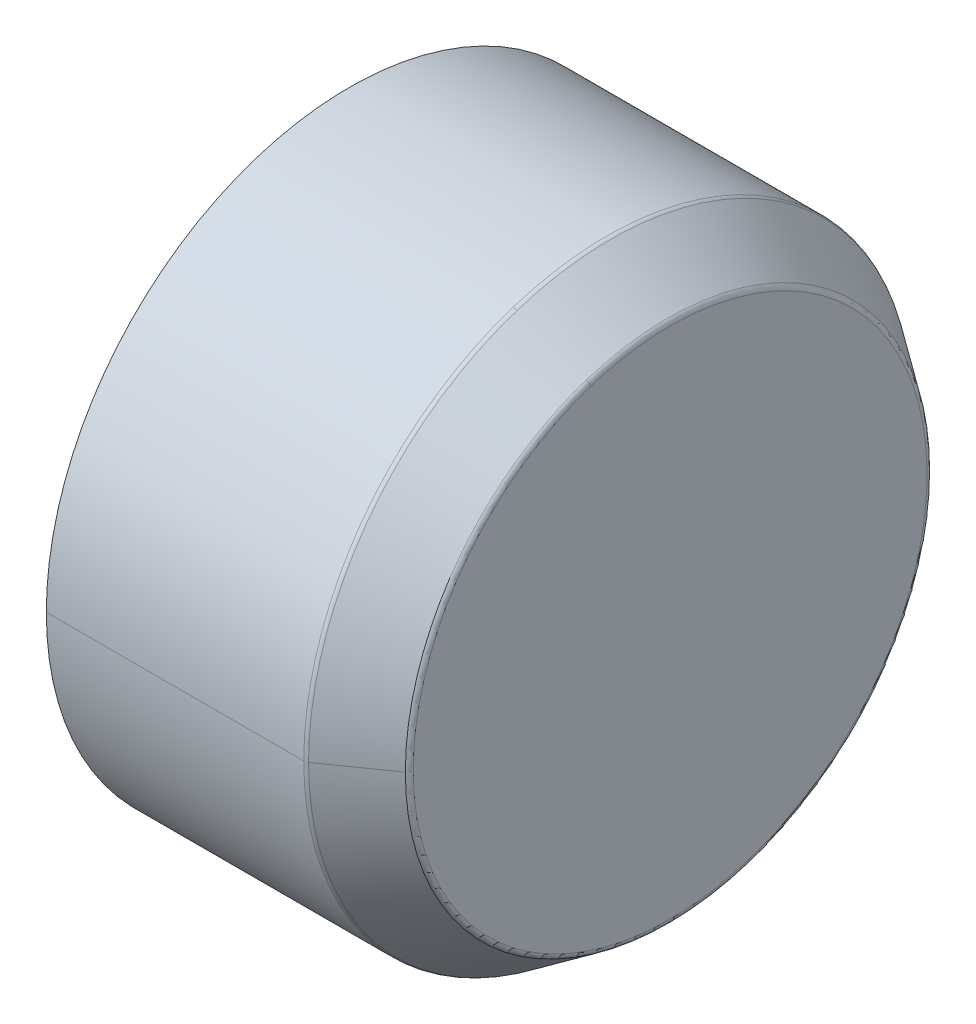
ISO-10303-21;
HEADER;
FILE_DESCRIPTION(('STEP AP214'),'2;1');
FILE_NAME('part.step','',(''),(''),'','','');
FILE_SCHEMA(('AUTOMOTIVE_DESIGN { 1 0 10303 214 1 1 1 1 }'));
ENDSEC;
DATA;
#1=APPLICATION_CONTEXT('core data for automotive mechanical design processes');
#2=APPLICATION_PROTOCOL_DEFINITION('international standard','automotive_design',2000,#1);
#3=PRODUCT_CONTEXT('',#1,'mechanical');
#4=PRODUCT('Part','Part','',(#3));
#5=PRODUCT_RELATED_PRODUCT_CATEGORY('part','',(#4));
#6=PRODUCT_DEFINITION_FORMATION('','',#4);
#7=PRODUCT_DEFINITION_CONTEXT('part definition',#1,'design');
#8=PRODUCT_DEFINITION('design','',#6,#7);
#9=PRODUCT_DEFINITION_SHAPE('','',#8);
#10=(LENGTH_UNIT() NAMED_UNIT(*) SI_UNIT(.MILLI.,.METRE.));
#11=(NAMED_UNIT(*) PLANE_ANGLE_UNIT() SI_UNIT($,.RADIAN.));
#12=(NAMED_UNIT(*) SI_UNIT($,.STERADIAN.) SOLID_ANGLE_UNIT());
#13=UNCERTAINTY_MEASURE_WITH_UNIT(LENGTH_MEASURE(1.E-05),#10,'distance_accuracy_value','');
#14=(GEOMETRIC_REPRESENTATION_CONTEXT(3) GLOBAL_UNCERTAINTY_ASSIGNED_CONTEXT((#13)) GLOBAL_UNIT_ASSIGNED_CONTEXT((#10,
#11,#12)) REPRESENTATION_CONTEXT('',''));
#15=CARTESIAN_POINT('',(0.,0.,0.));
#16=DIRECTION('',(0.,0.,1.));
#17=DIRECTION('',(1.,0.,0.));
#18=AXIS2_PLACEMENT_3D('',#15,#16,#17);
#19=CARTESIAN_POINT('',(0.,0.,0.));
#20=DIRECTION('',(1.,0.,0.));
#21=DIRECTION('',(0.,0.,-1.));
#22=AXIS2_PLACEMENT_3D('',#19,#20,#21);
#23=PLANE('',#22);
#24=CARTESIAN_POINT('',(0.,0.,0.));
#25=DIRECTION('',(1.,0.,0.));
#26=DIRECTION('',(0.,0.,-1.));
#27=AXIS2_PLACEMENT_3D('',#24,#25,#26);
#28=CIRCLE('',#27,95.45);
#29=CARTESIAN_POINT('',(0.,0.,95.45));
#30=VERTEX_POINT('',#29);
#31=CARTESIAN_POINT('',(0.,0.,-95.45));
#32=VERTEX_POINT('',#31);
#33=EDGE_CURVE('E11',#30,#32,#28,.T.);
#34=ORIENTED_EDGE('',*,*,#33,.F.);
#35=CARTESIAN_POINT('',(0.,0.,0.));
#36=DIRECTION('',(1.,0.,0.));
#37=DIRECTION('',(0.,0.,-1.));
#38=AXIS2_PLACEMENT_3D('',#35,#36,#37);
#39=CIRCLE('',#38,95.45);
#40=EDGE_CURVE('E25',#32,#30,#39,.T.);
#41=ORIENTED_EDGE('',*,*,#40,.F.);
#42=EDGE_LOOP('',(#34,#41));
#43=FACE_BOUND('',#42,.T.);
#44=ADVANCED_FACE('F17',(#43),#23,.F.);
#45=CARTESIAN_POINT('',(101.,0.,0.));
#46=DIRECTION('',(1.,0.,0.));
#47=DIRECTION('',(0.,-1.,0.));
#48=AXIS2_PLACEMENT_3D('',#45,#46,#47);
#49=CYLINDRICAL_SURFACE('',#48,95.45);
#50=DIRECTION('',(1.,0.,0.));
#51=VECTOR('',#50,1.);
#52=CARTESIAN_POINT('',(0.,0.,95.45));
#53=LINE('',#52,#51);
#54=CARTESIAN_POINT('',(81.069402422242,0.,95.45));
#55=VERTEX_POINT('',#54);
#56=EDGE_CURVE('E185',#30,#55,#53,.T.);
#57=ORIENTED_EDGE('',*,*,#56,.T.);
#58=CARTESIAN_POINT('',(81.069402422242,0.,0.));
#59=DIRECTION('',(1.,0.,0.));
#60=DIRECTION('',(0.,0.,-1.));
#61=AXIS2_PLACEMENT_3D('',#58,#59,#60);
#62=CIRCLE('',#61,95.45);
#63=CARTESIAN_POINT('',(81.069402422242,90.7783444803724,29.4956721130887));
#64=VERTEX_POINT('',#63);
#65=EDGE_CURVE('E180',#64,#55,#62,.T.);
#66=ORIENTED_EDGE('',*,*,#65,.F.);
#67=CARTESIAN_POINT('',(81.069402422242,0.,0.));
#68=DIRECTION('',(1.,0.,0.));
#69=DIRECTION('',(0.,0.,-1.));
#70=AXIS2_PLACEMENT_3D('',#67,#68,#69);
#71=CIRCLE('',#70,95.45);
#72=CARTESIAN_POINT('',(81.069402422242,0.,-95.45));
#73=VERTEX_POINT('',#72);
#74=EDGE_CURVE('E175',#73,#64,#71,.T.);
#75=ORIENTED_EDGE('',*,*,#74,.F.);
#76=DIRECTION('',(1.,0.,0.));
#77=VECTOR('',#76,1.);
#78=CARTESIAN_POINT('',(0.,0.,-95.45));
#79=LINE('',#78,#77);
#80=EDGE_CURVE('E170',#32,#73,#79,.T.);
#81=ORIENTED_EDGE('',*,*,#80,.F.);
#82=ORIENTED_EDGE('',*,*,#40,.T.);
#83=EDGE_LOOP('',(#57,#66,#75,#81,#82));
#84=FACE_BOUND('',#83,.T.);
#85=ADVANCED_FACE('F194',(#84),#49,.T.);
#86=CARTESIAN_POINT('',(101.,0.,0.));
#87=DIRECTION('',(1.,0.,0.));
#88=DIRECTION('',(0.,1.,0.));
#89=AXIS2_PLACEMENT_3D('',#86,#87,#88);
#90=CYLINDRICAL_SURFACE('',#89,95.45);
#91=ORIENTED_EDGE('',*,*,#56,.F.);
#92=ORIENTED_EDGE('',*,*,#33,.T.);
#93=ORIENTED_EDGE('',*,*,#80,.T.);
#94=CARTESIAN_POINT('',(81.069402422242,0.,0.));
#95=DIRECTION('',(1.,0.,0.));
#96=DIRECTION('',(0.,0.,-1.));
#97=AXIS2_PLACEMENT_3D('',#94,#95,#96);
#98=CIRCLE('',#97,95.45);
#99=CARTESIAN_POINT('',(81.069402422242,-90.7783444803724,-29.4956721130887));
#100=VERTEX_POINT('',#99);
#101=EDGE_CURVE('E165',#100,#73,#98,.T.);
#102=ORIENTED_EDGE('',*,*,#101,.F.);
#103=CARTESIAN_POINT('',(81.069402422242,0.,0.));
#104=DIRECTION('',(1.,0.,0.));
#105=DIRECTION('',(0.,0.,-1.));
#106=AXIS2_PLACEMENT_3D('',#103,#104,#105);
#107=CIRCLE('',#106,95.45);
#108=EDGE_CURVE('E160',#55,#100,#107,.T.);
#109=ORIENTED_EDGE('',*,*,#108,.F.);
#110=EDGE_LOOP('',(#91,#92,#93,#102,#109));
#111=FACE_BOUND('',#110,.T.);
#112=ADVANCED_FACE('F197',(#111),#90,.T.);
#113=CARTESIAN_POINT('',(81.0694024222401,0.,0.));
#114=DIRECTION('',(1.,0.,0.));
#115=DIRECTION('',(0.,0.309016994374947,-0.951056516295154));
#116=AXIS2_PLACEMENT_3D('',#113,#114,#115);
#117=TOROIDAL_SURFACE('',#116,93.4499999999941,2.00000000000586);
#118=CARTESIAN_POINT('',(81.0694024222401,-88.8762314477765,-28.877638124337));
#119=DIRECTION('',(0.,0.309016994374947,-0.951056516295154));
#120=DIRECTION('',(0.573576436350263,-0.779059889558063,-0.253131902662447));
#121=AXIS2_PLACEMENT_3D('',#118,#119,#120);
#122=CIRCLE('',#121,2.00000000000585);
#123=CARTESIAN_POINT('',(82.216555294944,-90.4343512268972,-29.3839019296634));
#124=VERTEX_POINT('',#123);
#125=EDGE_CURVE('E155',#124,#100,#122,.T.);
#126=ORIENTED_EDGE('',*,*,#125,.F.);
#127=CARTESIAN_POINT('',(82.216555294944,0.,0.));
#128=DIRECTION('',(1.,0.,0.));
#129=DIRECTION('',(0.,0.,-1.));
#130=AXIS2_PLACEMENT_3D('',#127,#128,#129);
#131=CIRCLE('',#130,95.088304088578);
#132=CARTESIAN_POINT('',(82.216555294944,0.,95.088304088578));
#133=VERTEX_POINT('',#132);
#134=EDGE_CURVE('E150',#133,#124,#131,.T.);
#135=ORIENTED_EDGE('',*,*,#134,.F.);
#136=CARTESIAN_POINT('',(82.216555294944,0.,0.));
#137=DIRECTION('',(1.,0.,0.));
#138=DIRECTION('',(0.,0.,-1.));
#139=AXIS2_PLACEMENT_3D('',#136,#137,#138);
#140=CIRCLE('',#139,95.088304088578);
#141=CARTESIAN_POINT('',(82.216555294944,90.4343512268972,29.3839019296634));
#142=VERTEX_POINT('',#141);
#143=EDGE_CURVE('E145',#142,#133,#140,.T.);
#144=ORIENTED_EDGE('',*,*,#143,.F.);
#145=CARTESIAN_POINT('',(81.0694024222401,88.8762314477765,28.877638124337));
#146=DIRECTION('',(0.,-0.309016994374947,0.951056516295154));
#147=DIRECTION('',(0.573576436350263,0.779059889558063,0.253131902662447));
#148=AXIS2_PLACEMENT_3D('',#145,#146,#147);
#149=CIRCLE('',#148,2.00000000000585);
#150=EDGE_CURVE('E140',#142,#64,#149,.T.);
#151=ORIENTED_EDGE('',*,*,#150,.T.);
#152=ORIENTED_EDGE('',*,*,#65,.T.);
#153=ORIENTED_EDGE('',*,*,#108,.T.);
#154=EDGE_LOOP('',(#126,#135,#144,#151,#152,#153));
#155=FACE_BOUND('',#154,.T.);
#156=ADVANCED_FACE('F199',(#155),#117,.T.);
#157=CARTESIAN_POINT('',(81.0694024222401,0.,0.));
#158=DIRECTION('',(1.,0.,0.));
#159=DIRECTION('',(0.,-0.309016994374947,0.951056516295154));
#160=AXIS2_PLACEMENT_3D('',#157,#158,#159);
#161=TOROIDAL_SURFACE('',#160,93.4499999999941,2.00000000000586);
#162=ORIENTED_EDGE('',*,*,#125,.T.);
#163=ORIENTED_EDGE('',*,*,#101,.T.);
#164=ORIENTED_EDGE('',*,*,#74,.T.);
#165=ORIENTED_EDGE('',*,*,#150,.F.);
#166=CARTESIAN_POINT('',(82.216555294944,0.,0.));
#167=DIRECTION('',(1.,0.,0.));
#168=DIRECTION('',(0.,0.,-1.));
#169=AXIS2_PLACEMENT_3D('',#166,#167,#168);
#170=CIRCLE('',#169,95.088304088578);
#171=CARTESIAN_POINT('',(82.216555294944,0.,-95.088304088578));
#172=VERTEX_POINT('',#171);
#173=EDGE_CURVE('E135',#172,#142,#170,.T.);
#174=ORIENTED_EDGE('',*,*,#173,.F.);
#175=CARTESIAN_POINT('',(82.216555294944,0.,0.));
#176=DIRECTION('',(1.,0.,0.));
#177=DIRECTION('',(0.,0.,-1.));
#178=AXIS2_PLACEMENT_3D('',#175,#176,#177);
#179=CIRCLE('',#178,95.088304088578);
#180=EDGE_CURVE('E130',#124,#172,#179,.T.);
#181=ORIENTED_EDGE('',*,*,#180,.F.);
#182=EDGE_LOOP('',(#162,#163,#164,#165,#174,#181));
#183=FACE_BOUND('',#182,.T.);
#184=ADVANCED_FACE('F202',(#183),#161,.T.);
#185=CARTESIAN_POINT('',(82.216555294944,0.,0.));
#186=DIRECTION('',(-1.,0.,0.));
#187=DIRECTION('',(0.,1.,0.));
#188=AXIS2_PLACEMENT_3D('',#185,#186,#187);
#189=CONICAL_SURFACE('',#188,95.088304088578,0.610865238198071);
#190=DIRECTION('',(-0.81915204428896,0.,-0.573576436351092));
#191=VECTOR('',#190,1.);
#192=CARTESIAN_POINT('',(100.1471528727,0.,-82.533164500027));
#193=LINE('',#192,#191);
#194=CARTESIAN_POINT('',(100.1471528727,0.,-82.533164500027));
#195=VERTEX_POINT('',#194);
#196=EDGE_CURVE('E125',#195,#172,#193,.T.);
#197=ORIENTED_EDGE('',*,*,#196,.F.);
#198=CARTESIAN_POINT('',(100.1471528727,0.,0.));
#199=DIRECTION('',(1.,0.,0.));
#200=DIRECTION('',(0.,0.,-1.));
#201=AXIS2_PLACEMENT_3D('',#198,#199,#200);
#202=CIRCLE('',#201,82.533164500027);
#203=CARTESIAN_POINT('',(100.1471528727,-78.4937039082105,-25.5041504300514));
#204=VERTEX_POINT('',#203);
#205=EDGE_CURVE('E121',#204,#195,#202,.T.);
#206=ORIENTED_EDGE('',*,*,#205,.F.);
#207=CARTESIAN_POINT('',(100.1471528727,0.,0.));
#208=DIRECTION('',(1.,0.,0.));
#209=DIRECTION('',(0.,0.,-1.));
#210=AXIS2_PLACEMENT_3D('',#207,#208,#209);
#211=CIRCLE('',#210,82.533164500027);
#212=CARTESIAN_POINT('',(100.1471528727,0.,82.533164500027));
#213=VERTEX_POINT('',#212);
#214=EDGE_CURVE('E100',#213,#204,#211,.T.);
#215=ORIENTED_EDGE('',*,*,#214,.F.);
#216=DIRECTION('',(-0.81915204428896,0.,0.573576436351092));
#217=VECTOR('',#216,1.);
#218=CARTESIAN_POINT('',(100.1471528727,0.,82.533164500027));
#219=LINE('',#218,#217);
#220=EDGE_CURVE('E113',#213,#133,#219,.T.);
#221=ORIENTED_EDGE('',*,*,#220,.T.);
#222=ORIENTED_EDGE('',*,*,#134,.T.);
#223=ORIENTED_EDGE('',*,*,#180,.T.);
#224=EDGE_LOOP('',(#197,#206,#215,#221,#222,#223));
#225=FACE_BOUND('',#224,.T.);
#226=ADVANCED_FACE('F206',(#225),#189,.T.);
#227=CARTESIAN_POINT('',(82.216555294944,0.,0.));
#228=DIRECTION('',(-1.,0.,0.));
#229=DIRECTION('',(0.,-1.,0.));
#230=AXIS2_PLACEMENT_3D('',#227,#228,#229);
#231=CONICAL_SURFACE('',#230,95.088304088578,0.610865238198071);
#232=ORIENTED_EDGE('',*,*,#196,.T.);
#233=ORIENTED_EDGE('',*,*,#173,.T.);
#234=ORIENTED_EDGE('',*,*,#143,.T.);
#235=ORIENTED_EDGE('',*,*,#220,.F.);
#236=CARTESIAN_POINT('',(100.1471528727,0.,0.));
#237=DIRECTION('',(1.,0.,0.));
#238=DIRECTION('',(0.,0.,-1.));
#239=AXIS2_PLACEMENT_3D('',#236,#237,#238);
#240=CIRCLE('',#239,82.533164500027);
#241=CARTESIAN_POINT('',(100.1471528727,78.4937039082105,25.5041504300514));
#242=VERTEX_POINT('',#241);
#243=EDGE_CURVE('E103',#242,#213,#240,.T.);
#244=ORIENTED_EDGE('',*,*,#243,.F.);
#245=CARTESIAN_POINT('',(100.1471528727,0.,0.));
#246=DIRECTION('',(1.,0.,0.));
#247=DIRECTION('',(0.,0.,-1.));
#248=AXIS2_PLACEMENT_3D('',#245,#246,#247);
#249=CIRCLE('',#248,82.533164500027);
#250=EDGE_CURVE('E101',#195,#242,#249,.T.);
#251=ORIENTED_EDGE('',*,*,#250,.F.);
#252=EDGE_LOOP('',(#232,#233,#234,#235,#244,#251));
#253=FACE_BOUND('',#252,.T.);
#254=ADVANCED_FACE('F208',(#253),#231,.T.);
#255=CARTESIAN_POINT('',(99.0000000000297,0.,0.));
#256=DIRECTION('',(1.,0.,0.));
#257=DIRECTION('',(0.,-0.309016994374947,0.951056516295154));
#258=AXIS2_PLACEMENT_3D('',#255,#256,#257);
#259=TOROIDAL_SURFACE('',#258,80.894860411463,1.99999999997031);
#260=CARTESIAN_POINT('',(99.0000000000297,-76.9355841291087,-24.9978866247312));
#261=DIRECTION('',(0.,0.309016994374947,-0.951056516295154));
#262=DIRECTION('',(1.,0.,0.));
#263=AXIS2_PLACEMENT_3D('',#260,#261,#262);
#264=CIRCLE('',#263,1.99999999997031);
#265=CARTESIAN_POINT('',(101.,-76.9355841291087,-24.9978866247312));
#266=VERTEX_POINT('',#265);
#267=EDGE_CURVE('E84',#266,#204,#264,.T.);
#268=ORIENTED_EDGE('',*,*,#267,.T.);
#269=ORIENTED_EDGE('',*,*,#205,.T.);
#270=ORIENTED_EDGE('',*,*,#250,.T.);
#271=CARTESIAN_POINT('',(99.0000000000297,76.9355841291087,24.9978866247312));
#272=DIRECTION('',(0.,-0.309016994374947,0.951056516295154));
#273=DIRECTION('',(1.,0.,0.));
#274=AXIS2_PLACEMENT_3D('',#271,#272,#273);
#275=CIRCLE('',#274,1.99999999997031);
#276=CARTESIAN_POINT('',(101.,76.9355841291087,24.9978866247312));
#277=VERTEX_POINT('',#276);
#278=EDGE_CURVE('E88',#277,#242,#275,.T.);
#279=ORIENTED_EDGE('',*,*,#278,.F.);
#280=CARTESIAN_POINT('',(101.,-76.9355841290955,-24.9978866247269));
#281=CARTESIAN_POINT('',(101.,-73.0087657945784,-37.0827868436689));
#282=CARTESIAN_POINT('',(101.,-66.7100601743397,-48.3973909755806));
#283=CARTESIAN_POINT('',(101.,-58.2370107443647,-58.3175225821723));
#284=CARTESIAN_POINT('',(101.,-37.8579820725014,-74.3004449855333));
#285=CARTESIAN_POINT('',(101.,-12.9490175288514,-81.3929810463948));
#286=CARTESIAN_POINT('',(101.,0.0569335757090866,-82.4165937757394));
#287=CARTESIAN_POINT('',(101.,25.7687073939691,-79.3079265207053));
#288=CARTESIAN_POINT('',(101.,48.3971981352601,-66.7098896992318));
#289=CARTESIAN_POINT('',(101.,58.3175691404913,-58.2370633542358));
#290=CARTESIAN_POINT('',(101.,74.3004566706603,-37.8579591391482));
#291=CARTESIAN_POINT('',(101.,81.3929111178215,-12.9490107856864));
#292=CARTESIAN_POINT('',(101.,82.4168450416955,0.0568777673670056));
#293=CARTESIAN_POINT('',(101.,80.8620474867682,12.9128710668164));
#294=CARTESIAN_POINT('',(101.,76.9355841290954,24.9978866247269));
#295=B_SPLINE_CURVE_WITH_KNOTS('',5,(#280,#281,#282,#283,#284,#285,#286,#287,#288,#289,#290,
#291,#292,#293,#294),.UNSPECIFIED.,.F.,.F.,(6,3,3,3,6),(0.,0.785398163397448,1.5707963267949,
2.35619449019234,3.14159265358979),.UNSPECIFIED.);
#296=EDGE_CURVE('E78',#266,#277,#295,.T.);
#297=ORIENTED_EDGE('',*,*,#296,.F.);
#298=EDGE_LOOP('',(#268,#269,#270,#279,#297));
#299=FACE_BOUND('',#298,.T.);
#300=ADVANCED_FACE('F81',(#299),#259,.T.);
#301=CARTESIAN_POINT('',(101.,80.894860411449,0.));
#302=DIRECTION('',(-1.,0.,0.));
#303=DIRECTION('',(0.,0.,1.));
#304=AXIS2_PLACEMENT_3D('',#301,#302,#303);
#305=PLANE('',#304);
#306=ORIENTED_EDGE('',*,*,#296,.T.);
#307=CARTESIAN_POINT('',(101.,0.,0.));
#308=DIRECTION('',(1.,0.,0.));
#309=DIRECTION('',(0.,0.,-1.));
#310=AXIS2_PLACEMENT_3D('',#307,#308,#309);
#311=CIRCLE('',#310,80.894860411449);
#312=EDGE_CURVE('E92',#277,#266,#311,.T.);
#313=ORIENTED_EDGE('',*,*,#312,.T.);
#314=EDGE_LOOP('',(#306,#313));
#315=FACE_BOUND('',#314,.T.);
#316=ADVANCED_FACE('F95',(#315),#305,.F.);
#317=CARTESIAN_POINT('',(99.0000000000297,0.,0.));
#318=DIRECTION('',(1.,0.,0.));
#319=DIRECTION('',(0.,0.309016994374947,-0.951056516295154));
#320=AXIS2_PLACEMENT_3D('',#317,#318,#319);
#321=TOROIDAL_SURFACE('',#320,80.894860411463,1.99999999997031);
#322=ORIENTED_EDGE('',*,*,#267,.F.);
#323=ORIENTED_EDGE('',*,*,#312,.F.);
#324=ORIENTED_EDGE('',*,*,#278,.T.);
#325=ORIENTED_EDGE('',*,*,#243,.T.);
#326=ORIENTED_EDGE('',*,*,#214,.T.);
#327=EDGE_LOOP('',(#322,#323,#324,#325,#326));
#328=FACE_BOUND('',#327,.T.);
#329=ADVANCED_FACE('F98',(#328),#321,.T.);
#330=CLOSED_SHELL('',(#44,#85,#112,#156,#184,#226,#254,#300,#316,#329));
#331=MANIFOLD_SOLID_BREP('B1',#330);
#332=ADVANCED_BREP_SHAPE_REPRESENTATION('',(#18,#331),#14);
#333=SHAPE_DEFINITION_REPRESENTATION(#9,#332);
ENDSEC;
END-ISO-10303-21;
